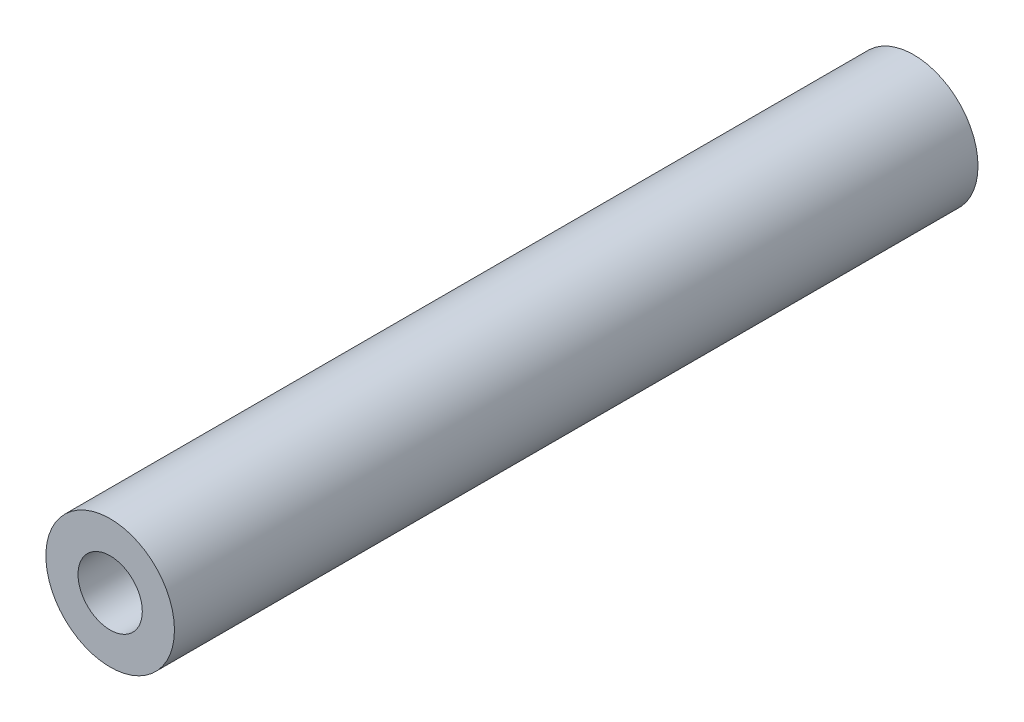
ISO-10303-21;
HEADER;
FILE_DESCRIPTION(('STEP AP214'),'2;1');
FILE_NAME('part.step','',(''),(''),'','','');
FILE_SCHEMA(('AUTOMOTIVE_DESIGN { 1 0 10303 214 1 1 1 1 }'));
ENDSEC;
DATA;
#1=APPLICATION_CONTEXT('core data for automotive mechanical design processes');
#2=APPLICATION_PROTOCOL_DEFINITION('international standard','automotive_design',2000,#1);
#3=PRODUCT_CONTEXT('',#1,'mechanical');
#4=PRODUCT('Part','Part','',(#3));
#5=PRODUCT_RELATED_PRODUCT_CATEGORY('part','',(#4));
#6=PRODUCT_DEFINITION_FORMATION('','',#4);
#7=PRODUCT_DEFINITION_CONTEXT('part definition',#1,'design');
#8=PRODUCT_DEFINITION('design','',#6,#7);
#9=PRODUCT_DEFINITION_SHAPE('','',#8);
#10=(LENGTH_UNIT() NAMED_UNIT(*) SI_UNIT(.MILLI.,.METRE.));
#11=(NAMED_UNIT(*) PLANE_ANGLE_UNIT() SI_UNIT($,.RADIAN.));
#12=(NAMED_UNIT(*) SI_UNIT($,.STERADIAN.) SOLID_ANGLE_UNIT());
#13=UNCERTAINTY_MEASURE_WITH_UNIT(LENGTH_MEASURE(1.E-05),#10,'distance_accuracy_value','');
#14=(GEOMETRIC_REPRESENTATION_CONTEXT(3) GLOBAL_UNCERTAINTY_ASSIGNED_CONTEXT((#13)) GLOBAL_UNIT_ASSIGNED_CONTEXT((#10,
#11,#12)) REPRESENTATION_CONTEXT('',''));
#15=CARTESIAN_POINT('',(0.,0.,0.));
#16=DIRECTION('',(0.,0.,1.));
#17=DIRECTION('',(1.,0.,0.));
#18=AXIS2_PLACEMENT_3D('',#15,#16,#17);
#19=CARTESIAN_POINT('',(0.,0.,25.));
#20=DIRECTION('',(0.,0.,1.));
#21=DIRECTION('',(1.,0.,0.));
#22=AXIS2_PLACEMENT_3D('',#19,#20,#21);
#23=PLANE('',#22);
#24=CARTESIAN_POINT('',(0.,0.,25.));
#25=DIRECTION('',(0.,0.,1.));
#26=DIRECTION('',(1.,0.,0.));
#27=AXIS2_PLACEMENT_3D('',#24,#25,#26);
#28=CIRCLE('',#27,4.);
#29=CARTESIAN_POINT('',(4.,0.,25.));
#30=VERTEX_POINT('',#29);
#31=EDGE_CURVE('E10',#30,#30,#28,.T.);
#32=ORIENTED_EDGE('',*,*,#31,.T.);
#33=EDGE_LOOP('',(#32));
#34=FACE_BOUND('',#33,.T.);
#35=CARTESIAN_POINT('',(0.,0.,25.));
#36=DIRECTION('',(0.,0.,1.));
#37=DIRECTION('',(1.,0.,0.));
#38=AXIS2_PLACEMENT_3D('',#35,#36,#37);
#39=CIRCLE('',#38,2.);
#40=CARTESIAN_POINT('',(2.,0.,25.));
#41=VERTEX_POINT('',#40);
#42=EDGE_CURVE('E39',#41,#41,#39,.T.);
#43=ORIENTED_EDGE('',*,*,#42,.F.);
#44=EDGE_LOOP('',(#43));
#45=FACE_BOUND('',#44,.T.);
#46=ADVANCED_FACE('F28',(#34,#45),#23,.T.);
#47=CARTESIAN_POINT('',(0.,0.,-25.));
#48=DIRECTION('',(0.,0.,1.));
#49=DIRECTION('',(1.,0.,0.));
#50=AXIS2_PLACEMENT_3D('',#47,#48,#49);
#51=PLANE('',#50);
#52=CARTESIAN_POINT('',(0.,0.,-25.));
#53=DIRECTION('',(0.,0.,1.));
#54=DIRECTION('',(1.,0.,0.));
#55=AXIS2_PLACEMENT_3D('',#52,#53,#54);
#56=CIRCLE('',#55,4.);
#57=CARTESIAN_POINT('',(4.,0.,-25.));
#58=VERTEX_POINT('',#57);
#59=EDGE_CURVE('E32',#58,#58,#56,.T.);
#60=ORIENTED_EDGE('',*,*,#59,.F.);
#61=EDGE_LOOP('',(#60));
#62=FACE_BOUND('',#61,.T.);
#63=CARTESIAN_POINT('',(0.,0.,-25.));
#64=DIRECTION('',(0.,0.,1.));
#65=DIRECTION('',(1.,0.,0.));
#66=AXIS2_PLACEMENT_3D('',#63,#64,#65);
#67=CIRCLE('',#66,2.);
#68=CARTESIAN_POINT('',(2.,0.,-25.));
#69=VERTEX_POINT('',#68);
#70=EDGE_CURVE('E41',#69,#69,#67,.T.);
#71=ORIENTED_EDGE('',*,*,#70,.T.);
#72=EDGE_LOOP('',(#71));
#73=FACE_BOUND('',#72,.T.);
#74=ADVANCED_FACE('F51',(#62,#73),#51,.F.);
#75=CARTESIAN_POINT('',(0.,0.,25.));
#76=DIRECTION('',(0.,0.,-1.));
#77=DIRECTION('',(-1.,0.,0.));
#78=AXIS2_PLACEMENT_3D('',#75,#76,#77);
#79=CYLINDRICAL_SURFACE('',#78,4.);
#80=ORIENTED_EDGE('',*,*,#31,.F.);
#81=EDGE_LOOP('',(#80));
#82=FACE_BOUND('',#81,.T.);
#83=ORIENTED_EDGE('',*,*,#59,.T.);
#84=EDGE_LOOP('',(#83));
#85=FACE_BOUND('',#84,.T.);
#86=ADVANCED_FACE('F30',(#82,#85),#79,.T.);
#87=CARTESIAN_POINT('',(0.,0.,25.));
#88=DIRECTION('',(0.,0.,-1.));
#89=DIRECTION('',(-1.,0.,0.));
#90=AXIS2_PLACEMENT_3D('',#87,#88,#89);
#91=CYLINDRICAL_SURFACE('',#90,2.);
#92=ORIENTED_EDGE('',*,*,#42,.T.);
#93=EDGE_LOOP('',(#92));
#94=FACE_BOUND('',#93,.T.);
#95=ORIENTED_EDGE('',*,*,#70,.F.);
#96=EDGE_LOOP('',(#95));
#97=FACE_BOUND('',#96,.T.);
#98=ADVANCED_FACE('F47',(#94,#97),#91,.F.);
#99=CLOSED_SHELL('',(#46,#74,#86,#98));
#100=MANIFOLD_SOLID_BREP('B2',#99);
#101=ADVANCED_BREP_SHAPE_REPRESENTATION('',(#18,#100),#14);
#102=SHAPE_DEFINITION_REPRESENTATION(#9,#101);
ENDSEC;
END-ISO-10303-21;
